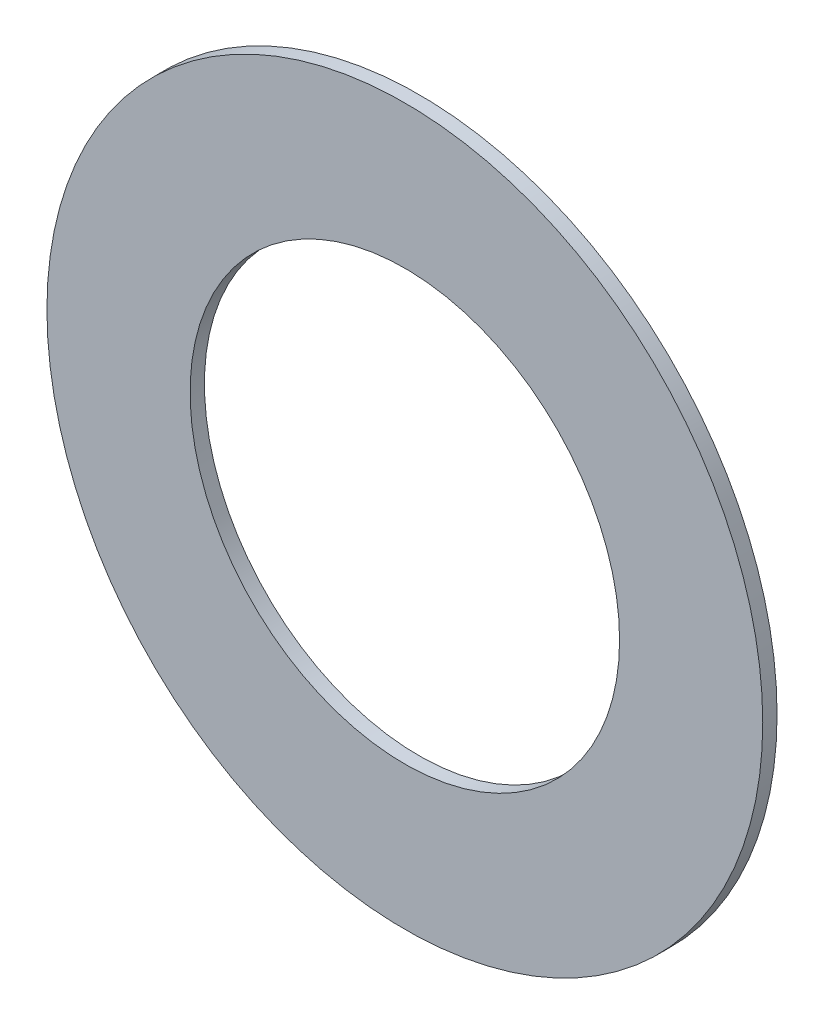
ISO-10303-21;
HEADER;
FILE_DESCRIPTION(('STEP AP214'),'2;1');
FILE_NAME('part.step','',(''),(''),'','','');
FILE_SCHEMA(('AUTOMOTIVE_DESIGN { 1 0 10303 214 1 1 1 1 }'));
ENDSEC;
DATA;
#1=APPLICATION_CONTEXT('core data for automotive mechanical design processes');
#2=APPLICATION_PROTOCOL_DEFINITION('international standard','automotive_design',2000,#1);
#3=PRODUCT_CONTEXT('',#1,'mechanical');
#4=PRODUCT('Part','Part','',(#3));
#5=PRODUCT_RELATED_PRODUCT_CATEGORY('part','',(#4));
#6=PRODUCT_DEFINITION_FORMATION('','',#4);
#7=PRODUCT_DEFINITION_CONTEXT('part definition',#1,'design');
#8=PRODUCT_DEFINITION('design','',#6,#7);
#9=PRODUCT_DEFINITION_SHAPE('','',#8);
#10=(LENGTH_UNIT() NAMED_UNIT(*) SI_UNIT(.MILLI.,.METRE.));
#11=(NAMED_UNIT(*) PLANE_ANGLE_UNIT() SI_UNIT($,.RADIAN.));
#12=(NAMED_UNIT(*) SI_UNIT($,.STERADIAN.) SOLID_ANGLE_UNIT());
#13=UNCERTAINTY_MEASURE_WITH_UNIT(LENGTH_MEASURE(1.E-05),#10,'distance_accuracy_value','');
#14=(GEOMETRIC_REPRESENTATION_CONTEXT(3) GLOBAL_UNCERTAINTY_ASSIGNED_CONTEXT((#13)) GLOBAL_UNIT_ASSIGNED_CONTEXT((#10,
#11,#12)) REPRESENTATION_CONTEXT('',''));
#15=CARTESIAN_POINT('',(0.,0.,0.));
#16=DIRECTION('',(0.,0.,1.));
#17=DIRECTION('',(1.,0.,0.));
#18=AXIS2_PLACEMENT_3D('',#15,#16,#17);
#19=CARTESIAN_POINT('',(0.,0.,0.05));
#20=DIRECTION('',(0.,0.,1.));
#21=DIRECTION('',(1.,0.,0.));
#22=AXIS2_PLACEMENT_3D('',#19,#20,#21);
#23=PLANE('',#22);
#24=CARTESIAN_POINT('',(0.,0.,0.05));
#25=DIRECTION('',(0.,0.,1.));
#26=DIRECTION('',(1.,0.,0.));
#27=AXIS2_PLACEMENT_3D('',#24,#25,#26);
#28=CIRCLE('',#27,2.5);
#29=CARTESIAN_POINT('',(2.5,0.,0.05));
#30=VERTEX_POINT('',#29);
#31=EDGE_CURVE('E10',#30,#30,#28,.T.);
#32=ORIENTED_EDGE('',*,*,#31,.T.);
#33=EDGE_LOOP('',(#32));
#34=FACE_BOUND('',#33,.T.);
#35=CARTESIAN_POINT('',(0.,0.,0.05));
#36=DIRECTION('',(0.,0.,1.));
#37=DIRECTION('',(1.,0.,0.));
#38=AXIS2_PLACEMENT_3D('',#35,#36,#37);
#39=CIRCLE('',#38,1.5);
#40=CARTESIAN_POINT('',(1.5,0.,0.05));
#41=VERTEX_POINT('',#40);
#42=EDGE_CURVE('E44',#41,#41,#39,.T.);
#43=ORIENTED_EDGE('',*,*,#42,.F.);
#44=EDGE_LOOP('',(#43));
#45=FACE_BOUND('',#44,.T.);
#46=ADVANCED_FACE('F33',(#34,#45),#23,.T.);
#47=CARTESIAN_POINT('',(0.,0.,-0.05));
#48=DIRECTION('',(0.,0.,1.));
#49=DIRECTION('',(1.,0.,0.));
#50=AXIS2_PLACEMENT_3D('',#47,#48,#49);
#51=PLANE('',#50);
#52=CARTESIAN_POINT('',(0.,0.,-0.05));
#53=DIRECTION('',(0.,0.,1.));
#54=DIRECTION('',(1.,0.,0.));
#55=AXIS2_PLACEMENT_3D('',#52,#53,#54);
#56=CIRCLE('',#55,2.5);
#57=CARTESIAN_POINT('',(2.5,0.,-0.05));
#58=VERTEX_POINT('',#57);
#59=EDGE_CURVE('E37',#58,#58,#56,.T.);
#60=ORIENTED_EDGE('',*,*,#59,.F.);
#61=EDGE_LOOP('',(#60));
#62=FACE_BOUND('',#61,.T.);
#63=CARTESIAN_POINT('',(0.,0.,-0.05));
#64=DIRECTION('',(0.,0.,1.));
#65=DIRECTION('',(1.,0.,0.));
#66=AXIS2_PLACEMENT_3D('',#63,#64,#65);
#67=CIRCLE('',#66,1.5);
#68=CARTESIAN_POINT('',(1.5,0.,-0.05));
#69=VERTEX_POINT('',#68);
#70=EDGE_CURVE('E46',#69,#69,#67,.T.);
#71=ORIENTED_EDGE('',*,*,#70,.T.);
#72=EDGE_LOOP('',(#71));
#73=FACE_BOUND('',#72,.T.);
#74=ADVANCED_FACE('F56',(#62,#73),#51,.F.);
#75=CARTESIAN_POINT('',(0.,0.,0.05));
#76=DIRECTION('',(0.,0.,-1.));
#77=DIRECTION('',(-1.,0.,0.));
#78=AXIS2_PLACEMENT_3D('',#75,#76,#77);
#79=CYLINDRICAL_SURFACE('',#78,2.5);
#80=ORIENTED_EDGE('',*,*,#31,.F.);
#81=EDGE_LOOP('',(#80));
#82=FACE_BOUND('',#81,.T.);
#83=ORIENTED_EDGE('',*,*,#59,.T.);
#84=EDGE_LOOP('',(#83));
#85=FACE_BOUND('',#84,.T.);
#86=ADVANCED_FACE('F35',(#82,#85),#79,.T.);
#87=CARTESIAN_POINT('',(0.,0.,0.05));
#88=DIRECTION('',(0.,0.,-1.));
#89=DIRECTION('',(-1.,0.,0.));
#90=AXIS2_PLACEMENT_3D('',#87,#88,#89);
#91=CYLINDRICAL_SURFACE('',#90,1.5);
#92=ORIENTED_EDGE('',*,*,#42,.T.);
#93=EDGE_LOOP('',(#92));
#94=FACE_BOUND('',#93,.T.);
#95=ORIENTED_EDGE('',*,*,#70,.F.);
#96=EDGE_LOOP('',(#95));
#97=FACE_BOUND('',#96,.T.);
#98=ADVANCED_FACE('F52',(#94,#97),#91,.F.);
#99=CLOSED_SHELL('',(#46,#74,#86,#98));
#100=MANIFOLD_SOLID_BREP('B2',#99);
#101=ADVANCED_BREP_SHAPE_REPRESENTATION('',(#18,#100),#14);
#102=SHAPE_DEFINITION_REPRESENTATION(#9,#101);
ENDSEC;
END-ISO-10303-21;
